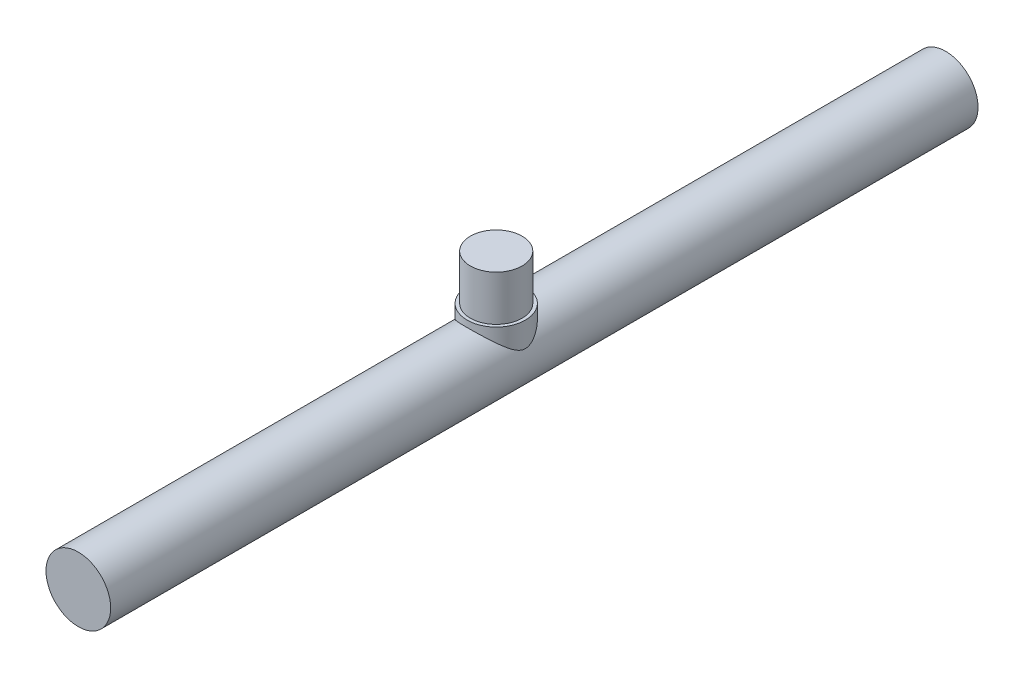
ISO-10303-21;
HEADER;
FILE_DESCRIPTION(('STEP AP214'),'2;1');
FILE_NAME('part.step','',(''),(''),'','','');
FILE_SCHEMA(('AUTOMOTIVE_DESIGN { 1 0 10303 214 1 1 1 1 }'));
ENDSEC;
DATA;
#1=APPLICATION_CONTEXT('core data for automotive mechanical design processes');
#2=APPLICATION_PROTOCOL_DEFINITION('international standard','automotive_design',2000,#1);
#3=PRODUCT_CONTEXT('',#1,'mechanical');
#4=PRODUCT('Part','Part','',(#3));
#5=PRODUCT_RELATED_PRODUCT_CATEGORY('part','',(#4));
#6=PRODUCT_DEFINITION_FORMATION('','',#4);
#7=PRODUCT_DEFINITION_CONTEXT('part definition',#1,'design');
#8=PRODUCT_DEFINITION('design','',#6,#7);
#9=PRODUCT_DEFINITION_SHAPE('','',#8);
#10=(LENGTH_UNIT() NAMED_UNIT(*) SI_UNIT(.MILLI.,.METRE.));
#11=(NAMED_UNIT(*) PLANE_ANGLE_UNIT() SI_UNIT($,.RADIAN.));
#12=(NAMED_UNIT(*) SI_UNIT($,.STERADIAN.) SOLID_ANGLE_UNIT());
#13=UNCERTAINTY_MEASURE_WITH_UNIT(LENGTH_MEASURE(1.E-05),#10,'distance_accuracy_value','');
#14=(GEOMETRIC_REPRESENTATION_CONTEXT(3) GLOBAL_UNCERTAINTY_ASSIGNED_CONTEXT((#13)) GLOBAL_UNIT_ASSIGNED_CONTEXT((#10,
#11,#12)) REPRESENTATION_CONTEXT('',''));
#15=CARTESIAN_POINT('',(0.,0.,0.));
#16=DIRECTION('',(0.,0.,1.));
#17=DIRECTION('',(1.,0.,0.));
#18=AXIS2_PLACEMENT_3D('',#15,#16,#17);
#19=CARTESIAN_POINT('',(0.,0.,70.));
#20=DIRECTION('',(0.,0.,-1.));
#21=DIRECTION('',(-1.,0.,0.));
#22=AXIS2_PLACEMENT_3D('',#19,#20,#21);
#23=CYLINDRICAL_SURFACE('',#22,5.);
#24=CARTESIAN_POINT('',(0.,0.,70.));
#25=DIRECTION('',(0.,0.,1.));
#26=DIRECTION('',(1.,0.,0.));
#27=AXIS2_PLACEMENT_3D('',#24,#25,#26);
#28=CIRCLE('',#27,5.);
#29=CARTESIAN_POINT('',(5.,0.,70.));
#30=VERTEX_POINT('',#29);
#31=EDGE_CURVE('E47',#30,#30,#28,.T.);
#32=ORIENTED_EDGE('',*,*,#31,.F.);
#33=EDGE_LOOP('',(#32));
#34=FACE_BOUND('',#33,.T.);
#35=CARTESIAN_POINT('',(0.,5.,0.886677191296589));
#36=CARTESIAN_POINT('',(-0.104323069318822,5.00000385560688,0.886673293785215));
#37=CARTESIAN_POINT('',(-0.208613683627537,4.99673083088493,0.890308870921456));
#38=CARTESIAN_POINT('',(-0.416323250117251,4.98372275722187,0.904768737997536));
#39=CARTESIAN_POINT('',(-0.519742029129327,4.97398645376978,0.91559442352491));
#40=CARTESIAN_POINT('',(-0.72486878360401,4.94825845134484,0.944234060109418));
#41=CARTESIAN_POINT('',(-0.826575738997414,4.9322631513531,0.962052034090864));
#42=CARTESIAN_POINT('',(-1.0275094148976,4.89435214818953,1.00435235175603));
#43=CARTESIAN_POINT('',(-1.12673498438584,4.872433751204,1.0288377278009));
#44=CARTESIAN_POINT('',(-1.32134775449686,4.82328135323624,1.08386475122852));
#45=CARTESIAN_POINT('',(-1.41675678171171,4.79608522375577,1.11436327352869));
#46=CARTESIAN_POINT('',(-1.60399192651644,4.73675681042415,1.18107407429181));
#47=CARTESIAN_POINT('',(-1.69581671493531,4.70462271679316,1.21728844776516));
#48=CARTESIAN_POINT('',(-1.96527027810788,4.60159261204964,1.33378075067206));
#49=CARTESIAN_POINT('',(-2.13700051948108,4.5240369170597,1.42194329296516));
#50=CARTESIAN_POINT('',(-2.52752911854586,4.32172247457821,1.6541479667322));
#51=CARTESIAN_POINT('',(-2.73800661041019,4.19043806098301,1.80648844063463));
#52=CARTESIAN_POINT('',(-3.02735331691641,3.98113257731917,2.05480429546158));
#53=CARTESIAN_POINT('',(-3.11953610907879,3.9091733052144,2.14103413393534));
#54=CARTESIAN_POINT('',(-3.29523835924973,3.7622456331702,2.31958165714958));
#55=CARTESIAN_POINT('',(-3.37875894709671,3.68727762744297,2.41189854536121));
#56=CARTESIAN_POINT('',(-3.53907634016176,3.53377227909735,2.60441112734913));
#57=CARTESIAN_POINT('',(-3.61567114655015,3.45519247036577,2.70474027675231));
#58=CARTESIAN_POINT('',(-3.76004537822266,3.29749630845926,2.91121110162883));
#59=CARTESIAN_POINT('',(-3.8278224051488,3.21837981544183,3.01735434737585));
#60=CARTESIAN_POINT('',(-3.95446616385127,3.0614278795004,3.23538230594944));
#61=CARTESIAN_POINT('',(-4.01334878758602,2.98359037863421,3.34725628862112));
#62=CARTESIAN_POINT('',(-4.12220793014653,2.83127994768381,3.57736883705718));
#63=CARTESIAN_POINT('',(-4.1721901565516,2.75680488440354,3.69560326023489));
#64=CARTESIAN_POINT('',(-4.26273913568691,2.61459791351551,3.93896665290217));
#65=CARTESIAN_POINT('',(-4.30333858234702,2.5468430756239,4.0640697429812));
#66=CARTESIAN_POINT('',(-4.37443814148185,2.42268317499311,4.3226151633784));
#67=CARTESIAN_POINT('',(-4.40494806816112,2.36626710397315,4.45604923891565));
#68=CARTESIAN_POINT('',(-4.45009221827025,2.28005720572226,4.70831899194491));
#69=CARTESIAN_POINT('',(-4.46653946809781,2.2473735827722,4.82580294678331));
#70=CARTESIAN_POINT('',(-4.49009743403677,2.19994641818031,5.06513667138087));
#71=CARTESIAN_POINT('',(-4.4972333364716,2.1851544891395,5.18697374420472));
#72=CARTESIAN_POINT('',(-4.50144725458134,2.17646766158744,5.43227736586869));
#73=CARTESIAN_POINT('',(-4.49847108210899,2.18268534750827,5.55574915068856));
#74=CARTESIAN_POINT('',(-4.48269652799279,2.21488536818843,5.79952334335805));
#75=CARTESIAN_POINT('',(-4.46987657529382,2.24091110799682,5.91981818983099));
#76=CARTESIAN_POINT('',(-4.42822615318918,2.32241864781625,6.20497727976537));
#77=CARTESIAN_POINT('',(-4.39488844727564,2.38574462239082,6.36684455384053));
#78=CARTESIAN_POINT('',(-4.31352994056176,2.52988853021577,6.67883255055137));
#79=CARTESIAN_POINT('',(-4.26544743345507,2.61077954898599,6.82890051289326));
#80=CARTESIAN_POINT('',(-4.16023382189287,2.77512275950314,7.10800195477214));
#81=CARTESIAN_POINT('',(-4.10403439903715,2.85794355684176,7.2377703013647));
#82=CARTESIAN_POINT('',(-3.98082793522232,3.02720733815051,7.48969599813239));
#83=CARTESIAN_POINT('',(-3.91381269141894,3.11365303416066,7.61184747332724));
#84=CARTESIAN_POINT('',(-3.76909969625737,3.28735135913998,7.84902834852638));
#85=CARTESIAN_POINT('',(-3.69140203962744,3.3746039809472,7.96405781167331));
#86=CARTESIAN_POINT('',(-3.52525060207968,3.54781789629156,8.18702142945112));
#87=CARTESIAN_POINT('',(-3.43680140094241,3.63377972225264,8.29495857518583));
#88=CARTESIAN_POINT('',(-3.26238365919038,3.79058877912771,8.4884979636748));
#89=CARTESIAN_POINT('',(-3.17787310208495,3.86183789348435,8.57508538461417));
#90=CARTESIAN_POINT('',(-3.00070506048852,4.00106054801328,8.74236342713783));
#91=CARTESIAN_POINT('',(-2.90804543626807,4.069033220582,8.8230524897236));
#92=CARTESIAN_POINT('',(-2.61807632587465,4.26615965136678,9.05502827230243));
#93=CARTESIAN_POINT('',(-2.40830357317094,4.3889608490542,9.19675672727326));
#94=CARTESIAN_POINT('',(-2.00891372016392,4.58274576858342,9.41826448873363));
#95=CARTESIAN_POINT('',(-1.82570704643641,4.65915438314005,9.50479676314732));
#96=CARTESIAN_POINT('',(-1.53869151707384,4.75843571348543,9.61668943072928));
#97=CARTESIAN_POINT('',(-1.44095538879221,4.78898083910474,9.65101002921047));
#98=CARTESIAN_POINT('',(-1.24190255834377,4.84441281254006,9.71316929903778));
#99=CARTESIAN_POINT('',(-1.14058739355376,4.86930205650037,9.74101071544471));
#100=CARTESIAN_POINT('',(-0.934167822870373,4.91310007782664,9.78993417620455));
#101=CARTESIAN_POINT('',(-0.829039528101229,4.93195924438783,9.81096016701371));
#102=CARTESIAN_POINT('',(-0.61663068949093,4.96299086299156,9.84552641246734));
#103=CARTESIAN_POINT('',(-0.509351208720526,4.97516653738589,9.8590702745352));
#104=CARTESIAN_POINT('',(-0.293557596769319,4.99254821894276,9.87839797726419));
#105=CARTESIAN_POINT('',(-0.185043772898876,4.99775592418642,9.88418370856809));
#106=CARTESIAN_POINT('',(0.0322192087908629,5.00107624026526,9.8878730611953));
#107=CARTESIAN_POINT('',(0.140968341721478,4.99918956801042,9.88577747895104));
#108=CARTESIAN_POINT('',(0.34488852135495,4.98900880327511,9.87446217282806));
#109=CARTESIAN_POINT('',(0.440148433644109,4.9814965603781,9.86611172507342));
#110=CARTESIAN_POINT('',(0.629392622366823,4.96114302576785,9.84346568177874));
#111=CARTESIAN_POINT('',(0.723376494299015,4.94830008317124,9.82916824449143));
#112=CARTESIAN_POINT('',(1.0024006858412,4.90210405319487,9.77767514484078));
#113=CARTESIAN_POINT('',(1.18468824684231,4.86107446076565,9.73186845607293));
#114=CARTESIAN_POINT('',(1.5419031964309,4.76003378405092,9.61853228810616));
#115=CARTESIAN_POINT('',(1.71653905924152,4.69958042624071,9.55049596695726));
#116=CARTESIAN_POINT('',(2.05115047344793,4.56349226210431,9.39626135581673));
#117=CARTESIAN_POINT('',(2.21111972342676,4.48785097449111,9.31005531130609));
#118=CARTESIAN_POINT('',(2.59116315104942,4.28400288073323,9.07552740536851));
#119=CARTESIAN_POINT('',(2.80145572689419,4.14838716854784,8.91766109296548));
#120=CARTESIAN_POINT('',(3.08970832184314,3.93296743097796,8.66087603362455));
#121=CARTESIAN_POINT('',(3.18140804860964,3.85901116561206,8.57176371501682));
#122=CARTESIAN_POINT('',(3.35588519303285,3.70827349167271,8.3873644332108));
#123=CARTESIAN_POINT('',(3.43866403765267,3.63149253757321,8.29207846145144));
#124=CARTESIAN_POINT('',(3.5971983776374,3.47460673164474,8.09346346552441));
#125=CARTESIAN_POINT('',(3.67274876835253,3.3944660430531,7.98999993262949));
#126=CARTESIAN_POINT('',(3.81477270349026,3.23403470784183,7.77705269989562));
#127=CARTESIAN_POINT('',(3.88124309525545,3.15374401889954,7.66756692749472));
#128=CARTESIAN_POINT('',(4.00494940590422,2.99507439731445,7.44260286244573));
#129=CARTESIAN_POINT('',(4.06220548176497,2.91669161905423,7.32713840121608));
#130=CARTESIAN_POINT('',(4.16743885176111,2.76423736992051,7.08942255585934));
#131=CARTESIAN_POINT('',(4.21542372989973,2.6901624101491,6.96717682520622));
#132=CARTESIAN_POINT('',(4.2992001492412,2.55399646108694,6.72186537485028));
#133=CARTESIAN_POINT('',(4.33552529314953,2.49146599072087,6.59923161854618));
#134=CARTESIAN_POINT('',(4.39846852448647,2.37858041587511,6.34606938315161));
#135=CARTESIAN_POINT('',(4.42510065947808,2.32820772774591,6.21555265110059));
#136=CARTESIAN_POINT('',(4.46369356602865,2.25320907729235,5.96841613475971));
#137=CARTESIAN_POINT('',(4.47732935347441,2.2257385134613,5.85295717276454));
#138=CARTESIAN_POINT('',(4.4955482411831,2.18872266688753,5.61858626432162));
#139=CARTESIAN_POINT('',(4.50015124336607,2.17913797851957,5.49968249617191));
#140=CARTESIAN_POINT('',(4.49984071840516,2.17977755987913,5.26163971598701));
#141=CARTESIAN_POINT('',(4.49490325925379,2.19005164486187,5.14250086322193));
#142=CARTESIAN_POINT('',(4.47600515465026,2.22840986561493,4.90780267280161));
#143=CARTESIAN_POINT('',(4.46202464034128,2.25653321615484,4.79225180574531));
#144=CARTESIAN_POINT('',(4.41636100759137,2.34505808660717,4.50523685888512));
#145=CARTESIAN_POINT('',(4.37918437602893,2.41469664498973,4.33756944549787));
#146=CARTESIAN_POINT('',(4.31171371589105,2.53203959131055,4.09587386605167));
#147=CARTESIAN_POINT('',(4.28719711928351,2.57342012746683,4.0167590974929));
#148=CARTESIAN_POINT('',(4.2344519873121,2.65931305092617,3.86151385054949));
#149=CARTESIAN_POINT('',(4.2062244049173,2.70382463282708,3.78538261249724));
#150=CARTESIAN_POINT('',(4.12181201451008,2.83203624425443,3.57503468746953));
#151=CARTESIAN_POINT('',(4.06156029940217,2.91816690051385,3.44393235079234));
#152=CARTESIAN_POINT('',(3.92976779644326,3.09337826908612,3.18953371895356));
#153=CARTESIAN_POINT('',(3.85821888053772,3.1824610686486,3.06624313434244));
#154=CARTESIAN_POINT('',(3.70390268461336,3.36080397541621,2.82711970656882));
#155=CARTESIAN_POINT('',(3.62114059793842,3.45006398180172,2.71128344737706));
#156=CARTESIAN_POINT('',(3.44429368358151,3.6266328747903,2.48715941821687));
#157=CARTESIAN_POINT('',(3.35021406847163,3.71394263782361,2.37886820920376));
#158=CARTESIAN_POINT('',(3.08827790767751,3.93801668420416,2.10529584713944));
#159=CARTESIAN_POINT('',(2.9109150373814,4.07178340862073,1.94643617737512));
#160=CARTESIAN_POINT('',(2.52543142391445,4.32143631913977,1.65432190417374));
#161=CARTESIAN_POINT('',(2.31736754312744,4.4373547684152,1.52102099020573));
#162=CARTESIAN_POINT('',(1.91976086300277,4.62076768758108,1.31194694367145));
#163=CARTESIAN_POINT('',(1.73588124856833,4.69331441593767,1.2299671122039));
#164=CARTESIAN_POINT('',(1.4486613687327,4.78659977512055,1.12501210545285));
#165=CARTESIAN_POINT('',(1.35104551779428,4.81510091708016,1.09303493921789));
#166=CARTESIAN_POINT('',(1.15249123095578,4.86644357487765,1.03553467164839));
#167=CARTESIAN_POINT('',(1.05155349408605,4.88928627291366,1.01001022214825));
#168=CARTESIAN_POINT('',(0.795267708239305,4.93883633083943,0.954710838291803));
#169=CARTESIAN_POINT('',(0.638182060009022,4.96167070934571,0.929297858785664));
#170=CARTESIAN_POINT('',(0.320705474990817,4.99224985963921,0.895283720021901));
#171=CARTESIAN_POINT('',(0.160314416551453,4.99999407504619,0.886683180645502));
#172=CARTESIAN_POINT('',(0.,5.,0.886677191296589));
#173=B_SPLINE_CURVE_WITH_KNOTS('',3,(#35,#36,#37,#38,#39,#40,#41,#42,#43,#44,#45,#46,#47,#48,
#49,#50,#51,#52,#53,#54,#55,#56,#57,#58,#59,#60,#61,#62,#63,#64,#65,#66,#67,#68,#69,#70,#71,#72,
#73,#74,#75,#76,#77,#78,#79,#80,#81,#82,#83,#84,#85,#86,#87,#88,#89,#90,#91,#92,#93,#94,#95,#96,
#97,#98,#99,#100,#101,#102,#103,#104,#105,#106,#107,#108,#109,#110,#111,#112,#113,#114,#115,
#116,#117,#118,#119,#120,#121,#122,#123,#124,#125,#126,#127,#128,#129,#130,#131,#132,#133,#134,
#135,#136,#137,#138,#139,#140,#141,#142,#143,#144,#145,#146,#147,#148,#149,#150,#151,#152,#153,
#154,#155,#156,#157,#158,#159,#160,#161,#162,#163,#164,#165,#166,#167,#168,#169,#170,#171,#172),
.UNSPECIFIED.,.T.,.F.,(4,2,2,2,2,2,2,2,2,2,2,2,2,2,2,2,2,2,2,2,2,2,2,2,2,2,2,2,2,2,2,2,2,2,2,2,
2,2,2,2,2,2,2,2,2,2,2,2,2,2,2,2,2,2,2,2,2,2,2,2,2,2,2,2,2,2,2,2,4),(0.,0.312799785041466,
0.625660301727295,0.938701083256873,1.25188447546863,1.56289852461611,1.87402683448729,
2.49589420856813,3.36422921683756,3.79982115096056,4.23535619782116,4.68103889136451,
5.12684255434849,5.57184001402109,6.01655107329816,6.4596883702176,6.9023933451991,
7.27016750005932,7.63694478383877,8.00569063084355,8.37524683904132,8.90320427440667,
9.43340205736911,9.92440504544573,10.4157821810567,10.9071549595719,11.3983191592121,
11.819160391968,12.2401124583115,13.0795313608983,13.7264429988986,14.0500860659001,
14.3735917631055,14.6996943377709,15.0256395482581,15.3515053120281,15.6773381468854,
15.9647462929554,16.2522435139673,16.826718883713,17.4153317085441,18.0041962535142,
18.8865575645574,19.3294056542995,19.7721828016415,20.2251347305922,20.6782435309491,
21.1303472387212,21.5820795371935,22.0084314865139,22.4341630627948,22.7911237867208,
23.1472971327028,23.5043650905574,23.8622202538256,24.4148398005139,24.6925296857882,
24.9701483999882,25.4735447615429,25.9773049685798,26.4808326532193,26.9841293071071,
27.8003021577225,28.6149818926267,29.2541904656969,29.5736452164846,29.8930331683529,
30.3736983419583,30.854381237542),.UNSPECIFIED.);
#174=CARTESIAN_POINT('',(0.,5.,0.886677191296589));
#175=VERTEX_POINT('',#174);
#176=EDGE_CURVE('E35',#175,#175,#173,.T.);
#177=ORIENTED_EDGE('',*,*,#176,.F.);
#178=EDGE_LOOP('',(#177));
#179=FACE_BOUND('',#178,.T.);
#180=CARTESIAN_POINT('',(0.,0.,-64.11332281));
#181=DIRECTION('',(0.,0.,-1.));
#182=DIRECTION('',(-1.,0.,0.));
#183=AXIS2_PLACEMENT_3D('',#180,#181,#182);
#184=CIRCLE('',#183,5.);
#185=CARTESIAN_POINT('',(-5.,0.,-64.11332281));
#186=VERTEX_POINT('',#185);
#187=EDGE_CURVE('E65',#186,#186,#184,.T.);
#188=ORIENTED_EDGE('',*,*,#187,.F.);
#189=EDGE_LOOP('',(#188));
#190=FACE_BOUND('',#189,.T.);
#191=ADVANCED_FACE('F31',(#34,#179,#190),#23,.T.);
#192=CARTESIAN_POINT('',(0.,0.,70.));
#193=DIRECTION('',(0.,0.,1.));
#194=DIRECTION('',(1.,0.,0.));
#195=AXIS2_PLACEMENT_3D('',#192,#193,#194);
#196=PLANE('',#195);
#197=ORIENTED_EDGE('',*,*,#31,.T.);
#198=EDGE_LOOP('',(#197));
#199=FACE_BOUND('',#198,.T.);
#200=ADVANCED_FACE('F57',(#199),#196,.T.);
#201=CARTESIAN_POINT('',(0.,6.,5.38667719129659));
#202=DIRECTION('',(0.,-1.,0.));
#203=DIRECTION('',(0.,0.,-1.));
#204=AXIS2_PLACEMENT_3D('',#201,#202,#203);
#205=CYLINDRICAL_SURFACE('',#204,4.5);
#206=CARTESIAN_POINT('',(0.,6.,5.38667719129659));
#207=DIRECTION('',(0.,1.,0.));
#208=DIRECTION('',(0.,0.,1.));
#209=AXIS2_PLACEMENT_3D('',#206,#207,#208);
#210=CIRCLE('',#209,4.5);
#211=CARTESIAN_POINT('',(0.,6.,9.88667719129659));
#212=VERTEX_POINT('',#211);
#213=EDGE_CURVE('E52',#212,#212,#210,.T.);
#214=ORIENTED_EDGE('',*,*,#213,.F.);
#215=EDGE_LOOP('',(#214));
#216=FACE_BOUND('',#215,.T.);
#217=ORIENTED_EDGE('',*,*,#176,.T.);
#218=EDGE_LOOP('',(#217));
#219=FACE_BOUND('',#218,.T.);
#220=ADVANCED_FACE('F82',(#216,#219),#205,.T.);
#221=CARTESIAN_POINT('',(0.,6.,5.38667719129659));
#222=DIRECTION('',(0.,1.,0.));
#223=DIRECTION('',(0.,0.,1.));
#224=AXIS2_PLACEMENT_3D('',#221,#222,#223);
#225=PLANE('',#224);
#226=CARTESIAN_POINT('',(0.,6.,5.38667719129659));
#227=DIRECTION('',(0.,1.,0.));
#228=DIRECTION('',(0.,0.,1.));
#229=AXIS2_PLACEMENT_3D('',#226,#227,#228);
#230=CIRCLE('',#229,4.);
#231=CARTESIAN_POINT('',(0.,6.,9.38667719129659));
#232=VERTEX_POINT('',#231);
#233=EDGE_CURVE('E10',#232,#232,#230,.T.);
#234=ORIENTED_EDGE('',*,*,#233,.F.);
#235=EDGE_LOOP('',(#234));
#236=FACE_BOUND('',#235,.T.);
#237=ORIENTED_EDGE('',*,*,#213,.T.);
#238=EDGE_LOOP('',(#237));
#239=FACE_BOUND('',#238,.T.);
#240=ADVANCED_FACE('F74',(#236,#239),#225,.T.);
#241=CARTESIAN_POINT('',(0.,13.,5.38667719129659));
#242=DIRECTION('',(0.,-1.,0.));
#243=DIRECTION('',(0.,0.,-1.));
#244=AXIS2_PLACEMENT_3D('',#241,#242,#243);
#245=CYLINDRICAL_SURFACE('',#244,4.);
#246=CARTESIAN_POINT('',(0.,13.,5.38667719129659));
#247=DIRECTION('',(0.,1.,0.));
#248=DIRECTION('',(0.,0.,1.));
#249=AXIS2_PLACEMENT_3D('',#246,#247,#248);
#250=CIRCLE('',#249,4.);
#251=CARTESIAN_POINT('',(0.,13.,9.38667719129659));
#252=VERTEX_POINT('',#251);
#253=EDGE_CURVE('E50',#252,#252,#250,.T.);
#254=ORIENTED_EDGE('',*,*,#253,.F.);
#255=EDGE_LOOP('',(#254));
#256=FACE_BOUND('',#255,.T.);
#257=ORIENTED_EDGE('',*,*,#233,.T.);
#258=EDGE_LOOP('',(#257));
#259=FACE_BOUND('',#258,.T.);
#260=ADVANCED_FACE('F72',(#256,#259),#245,.T.);
#261=CARTESIAN_POINT('',(0.,13.,5.38667719129659));
#262=DIRECTION('',(0.,1.,0.));
#263=DIRECTION('',(0.,0.,1.));
#264=AXIS2_PLACEMENT_3D('',#261,#262,#263);
#265=PLANE('',#264);
#266=ORIENTED_EDGE('',*,*,#253,.T.);
#267=EDGE_LOOP('',(#266));
#268=FACE_BOUND('',#267,.T.);
#269=ADVANCED_FACE('F70',(#268),#265,.T.);
#270=CARTESIAN_POINT('',(0.,0.,-64.11332281));
#271=DIRECTION('',(0.,0.,-1.));
#272=DIRECTION('',(-1.,0.,0.));
#273=AXIS2_PLACEMENT_3D('',#270,#271,#272);
#274=PLANE('',#273);
#275=ORIENTED_EDGE('',*,*,#187,.T.);
#276=EDGE_LOOP('',(#275));
#277=FACE_BOUND('',#276,.T.);
#278=ADVANCED_FACE('F80',(#277),#274,.T.);
#279=CLOSED_SHELL('',(#191,#200,#220,#240,#260,#269,#278));
#280=MANIFOLD_SOLID_BREP('B2',#279);
#281=ADVANCED_BREP_SHAPE_REPRESENTATION('',(#18,#280),#14);
#282=SHAPE_DEFINITION_REPRESENTATION(#9,#281);
ENDSEC;
END-ISO-10303-21;
